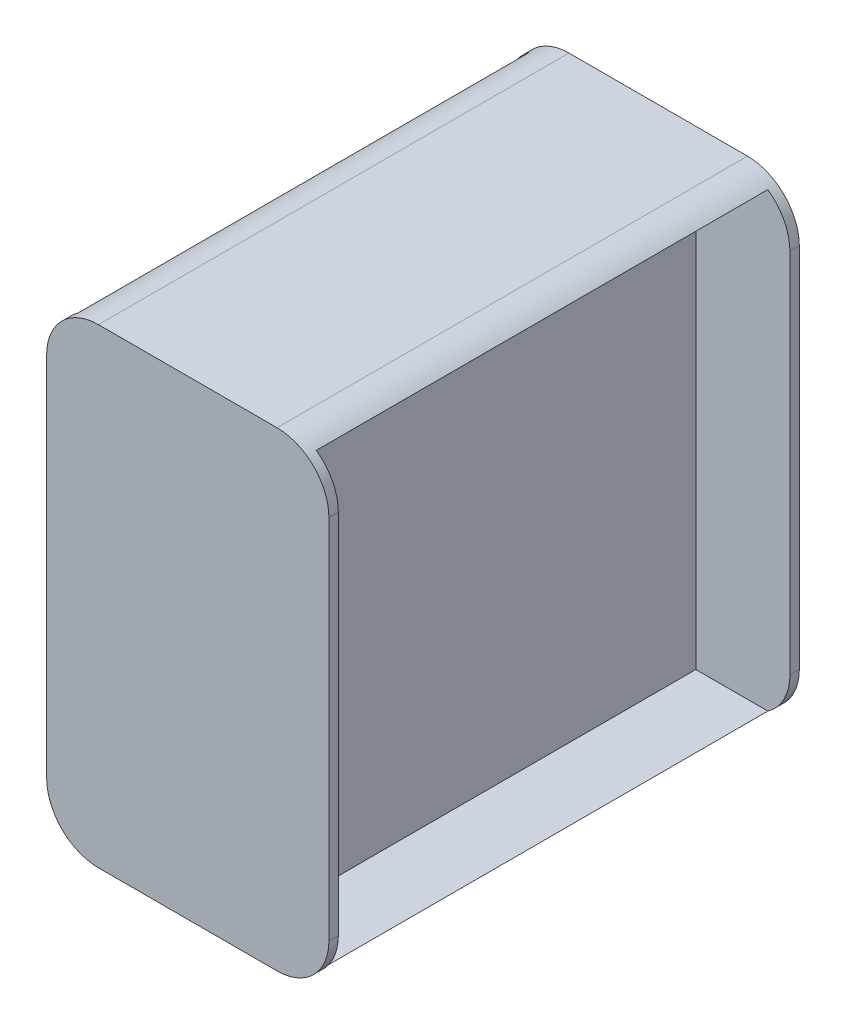
ISO-10303-21;
HEADER;
FILE_DESCRIPTION(('STEP AP214'),'2;1');
FILE_NAME('part.step','',(''),(''),'','','');
FILE_SCHEMA(('AUTOMOTIVE_DESIGN { 1 0 10303 214 1 1 1 1 }'));
ENDSEC;
DATA;
#1=APPLICATION_CONTEXT('core data for automotive mechanical design processes');
#2=APPLICATION_PROTOCOL_DEFINITION('international standard','automotive_design',2000,#1);
#3=PRODUCT_CONTEXT('',#1,'mechanical');
#4=PRODUCT('Part','Part','',(#3));
#5=PRODUCT_RELATED_PRODUCT_CATEGORY('part','',(#4));
#6=PRODUCT_DEFINITION_FORMATION('','',#4);
#7=PRODUCT_DEFINITION_CONTEXT('part definition',#1,'design');
#8=PRODUCT_DEFINITION('design','',#6,#7);
#9=PRODUCT_DEFINITION_SHAPE('','',#8);
#10=(LENGTH_UNIT() NAMED_UNIT(*) SI_UNIT(.MILLI.,.METRE.));
#11=(NAMED_UNIT(*) PLANE_ANGLE_UNIT() SI_UNIT($,.RADIAN.));
#12=(NAMED_UNIT(*) SI_UNIT($,.STERADIAN.) SOLID_ANGLE_UNIT());
#13=UNCERTAINTY_MEASURE_WITH_UNIT(LENGTH_MEASURE(1.E-05),#10,'distance_accuracy_value','');
#14=(GEOMETRIC_REPRESENTATION_CONTEXT(3) GLOBAL_UNCERTAINTY_ASSIGNED_CONTEXT((#13)) GLOBAL_UNIT_ASSIGNED_CONTEXT((#10,
#11,#12)) REPRESENTATION_CONTEXT('',''));
#15=CARTESIAN_POINT('',(0.,0.,0.));
#16=DIRECTION('',(0.,0.,1.));
#17=DIRECTION('',(1.,0.,0.));
#18=AXIS2_PLACEMENT_3D('',#15,#16,#17);
#19=CARTESIAN_POINT('',(19.05,63.5,-31.75));
#20=DIRECTION('',(-1.,0.,0.));
#21=DIRECTION('',(0.,0.,1.));
#22=AXIS2_PLACEMENT_3D('',#19,#20,#21);
#23=PLANE('',#22);
#24=DIRECTION('',(0.,-1.,0.));
#25=VECTOR('',#24,1.);
#26=CARTESIAN_POINT('',(19.05,63.5,31.75));
#27=LINE('',#26,#25);
#28=CARTESIAN_POINT('',(19.05,56.5,31.75));
#29=VERTEX_POINT('',#28);
#30=CARTESIAN_POINT('',(19.05,7.,31.75));
#31=VERTEX_POINT('',#30);
#32=EDGE_CURVE('E244',#29,#31,#27,.T.);
#33=ORIENTED_EDGE('',*,*,#32,.T.);
#34=DIRECTION('',(0.,0.,-1.));
#35=VECTOR('',#34,1.);
#36=CARTESIAN_POINT('',(19.05,7.,-31.75));
#37=LINE('',#36,#35);
#38=CARTESIAN_POINT('',(19.05,7.,30.48));
#39=VERTEX_POINT('',#38);
#40=EDGE_CURVE('E318',#31,#39,#37,.T.);
#41=ORIENTED_EDGE('',*,*,#40,.T.);
#42=DIRECTION('',(0.,-1.,0.));
#43=VECTOR('',#42,1.);
#44=CARTESIAN_POINT('',(19.05,0.,30.48));
#45=LINE('',#44,#43);
#46=CARTESIAN_POINT('',(19.05,56.5,30.48));
#47=VERTEX_POINT('',#46);
#48=EDGE_CURVE('E215',#47,#39,#45,.T.);
#49=ORIENTED_EDGE('',*,*,#48,.F.);
#50=DIRECTION('',(0.,0.,-1.));
#51=VECTOR('',#50,1.);
#52=CARTESIAN_POINT('',(19.05,56.5,31.75));
#53=LINE('',#52,#51);
#54=EDGE_CURVE('E270',#47,#29,#53,.F.);
#55=ORIENTED_EDGE('',*,*,#54,.T.);
#56=EDGE_LOOP('',(#33,#41,#49,#55));
#57=FACE_BOUND('',#56,.T.);
#58=ADVANCED_FACE('F36',(#57),#23,.F.);
#59=CARTESIAN_POINT('',(-19.05,63.5,-31.75));
#60=DIRECTION('',(1.,0.,0.));
#61=DIRECTION('',(0.,0.,-1.));
#62=AXIS2_PLACEMENT_3D('',#59,#60,#61);
#63=PLANE('',#62);
#64=DIRECTION('',(0.,-1.,0.));
#65=VECTOR('',#64,1.);
#66=CARTESIAN_POINT('',(-19.05,63.5,-31.75));
#67=LINE('',#66,#65);
#68=CARTESIAN_POINT('',(-19.05,56.5,-31.75));
#69=VERTEX_POINT('',#68);
#70=CARTESIAN_POINT('',(-19.05,7.,-31.75));
#71=VERTEX_POINT('',#70);
#72=EDGE_CURVE('E254',#69,#71,#67,.T.);
#73=ORIENTED_EDGE('',*,*,#72,.T.);
#74=DIRECTION('',(0.,0.,1.));
#75=VECTOR('',#74,1.);
#76=CARTESIAN_POINT('',(-19.05,7.,-31.75));
#77=LINE('',#76,#75);
#78=CARTESIAN_POINT('',(-19.05,7.,-30.48));
#79=VERTEX_POINT('',#78);
#80=EDGE_CURVE('E295',#71,#79,#77,.T.);
#81=ORIENTED_EDGE('',*,*,#80,.T.);
#82=DIRECTION('',(0.,-1.,0.));
#83=VECTOR('',#82,1.);
#84=CARTESIAN_POINT('',(-19.05,0.,-30.48));
#85=LINE('',#84,#83);
#86=CARTESIAN_POINT('',(-19.05,56.5,-30.48));
#87=VERTEX_POINT('',#86);
#88=EDGE_CURVE('E206',#87,#79,#85,.T.);
#89=ORIENTED_EDGE('',*,*,#88,.F.);
#90=DIRECTION('',(0.,0.,1.));
#91=VECTOR('',#90,1.);
#92=CARTESIAN_POINT('',(-19.05,56.5,-31.75));
#93=LINE('',#92,#91);
#94=EDGE_CURVE('E284',#87,#69,#93,.F.);
#95=ORIENTED_EDGE('',*,*,#94,.T.);
#96=EDGE_LOOP('',(#73,#81,#89,#95));
#97=FACE_BOUND('',#96,.T.);
#98=ADVANCED_FACE('F359',(#97),#63,.F.);
#99=DIRECTION('',(0.,-1.,0.));
#100=VECTOR('',#99,1.);
#101=CARTESIAN_POINT('',(-19.05,0.,30.48));
#102=LINE('',#101,#100);
#103=CARTESIAN_POINT('',(-19.05,56.5,30.48));
#104=VERTEX_POINT('',#103);
#105=CARTESIAN_POINT('',(-19.05,7.,30.48));
#106=VERTEX_POINT('',#105);
#107=EDGE_CURVE('E184',#104,#106,#102,.T.);
#108=ORIENTED_EDGE('',*,*,#107,.T.);
#109=DIRECTION('',(0.,0.,1.));
#110=VECTOR('',#109,1.);
#111=CARTESIAN_POINT('',(-19.05,7.,-31.75));
#112=LINE('',#111,#110);
#113=CARTESIAN_POINT('',(-19.05,7.,31.75));
#114=VERTEX_POINT('',#113);
#115=EDGE_CURVE('E293',#106,#114,#112,.T.);
#116=ORIENTED_EDGE('',*,*,#115,.T.);
#117=DIRECTION('',(0.,-1.,0.));
#118=VECTOR('',#117,1.);
#119=CARTESIAN_POINT('',(-19.05,63.5,31.75));
#120=LINE('',#119,#118);
#121=CARTESIAN_POINT('',(-19.05,56.5,31.75));
#122=VERTEX_POINT('',#121);
#123=EDGE_CURVE('E251',#122,#114,#120,.T.);
#124=ORIENTED_EDGE('',*,*,#123,.F.);
#125=DIRECTION('',(0.,0.,1.));
#126=VECTOR('',#125,1.);
#127=CARTESIAN_POINT('',(-19.05,56.5,-31.75));
#128=LINE('',#127,#126);
#129=EDGE_CURVE('E286',#122,#104,#128,.F.);
#130=ORIENTED_EDGE('',*,*,#129,.T.);
#131=EDGE_LOOP('',(#108,#116,#124,#130));
#132=FACE_BOUND('',#131,.T.);
#133=ADVANCED_FACE('F365',(#132),#63,.F.);
#134=DIRECTION('',(0.,-1.,0.));
#135=VECTOR('',#134,1.);
#136=CARTESIAN_POINT('',(19.05,0.,-30.48));
#137=LINE('',#136,#135);
#138=CARTESIAN_POINT('',(19.05,56.5,-30.48));
#139=VERTEX_POINT('',#138);
#140=CARTESIAN_POINT('',(19.05,7.,-30.48));
#141=VERTEX_POINT('',#140);
#142=EDGE_CURVE('E208',#139,#141,#137,.T.);
#143=ORIENTED_EDGE('',*,*,#142,.T.);
#144=DIRECTION('',(0.,0.,-1.));
#145=VECTOR('',#144,1.);
#146=CARTESIAN_POINT('',(19.05,7.,-31.75));
#147=LINE('',#146,#145);
#148=CARTESIAN_POINT('',(19.05,7.,-31.75));
#149=VERTEX_POINT('',#148);
#150=EDGE_CURVE('E316',#141,#149,#147,.T.);
#151=ORIENTED_EDGE('',*,*,#150,.T.);
#152=DIRECTION('',(0.,-1.,0.));
#153=VECTOR('',#152,1.);
#154=CARTESIAN_POINT('',(19.05,63.5,-31.75));
#155=LINE('',#154,#153);
#156=CARTESIAN_POINT('',(19.05,56.5,-31.75));
#157=VERTEX_POINT('',#156);
#158=EDGE_CURVE('E257',#157,#149,#155,.T.);
#159=ORIENTED_EDGE('',*,*,#158,.F.);
#160=DIRECTION('',(0.,0.,-1.));
#161=VECTOR('',#160,1.);
#162=CARTESIAN_POINT('',(19.05,56.5,31.75));
#163=LINE('',#162,#161);
#164=EDGE_CURVE('E272',#157,#139,#163,.F.);
#165=ORIENTED_EDGE('',*,*,#164,.T.);
#166=EDGE_LOOP('',(#143,#151,#159,#165));
#167=FACE_BOUND('',#166,.T.);
#168=ADVANCED_FACE('F390',(#167),#23,.F.);
#169=CARTESIAN_POINT('',(-19.05,63.5,-31.75));
#170=DIRECTION('',(0.,0.,1.));
#171=DIRECTION('',(1.,0.,0.));
#172=AXIS2_PLACEMENT_3D('',#169,#170,#171);
#173=PLANE('',#172);
#174=DIRECTION('',(-1.,0.,0.));
#175=VECTOR('',#174,1.);
#176=CARTESIAN_POINT('',(-19.05,0.,-31.75));
#177=LINE('',#176,#175);
#178=CARTESIAN_POINT('',(12.05,0.,-31.75));
#179=VERTEX_POINT('',#178);
#180=CARTESIAN_POINT('',(-12.05,0.,-31.75));
#181=VERTEX_POINT('',#180);
#182=EDGE_CURVE('E229',#179,#181,#177,.T.);
#183=ORIENTED_EDGE('',*,*,#182,.T.);
#184=CARTESIAN_POINT('',(-12.05,7.,-31.75));
#185=DIRECTION('',(0.,0.,1.));
#186=DIRECTION('',(1.,0.,0.));
#187=AXIS2_PLACEMENT_3D('',#184,#185,#186);
#188=CIRCLE('',#187,7.);
#189=EDGE_CURVE('E314',#181,#71,#188,.F.);
#190=ORIENTED_EDGE('',*,*,#189,.T.);
#191=ORIENTED_EDGE('',*,*,#72,.F.);
#192=CARTESIAN_POINT('',(-12.05,56.5,-31.75));
#193=DIRECTION('',(0.,0.,1.));
#194=DIRECTION('',(1.,0.,0.));
#195=AXIS2_PLACEMENT_3D('',#192,#193,#194);
#196=CIRCLE('',#195,7.);
#197=CARTESIAN_POINT('',(-12.05,63.5,-31.75));
#198=VERTEX_POINT('',#197);
#199=EDGE_CURVE('E266',#69,#198,#196,.F.);
#200=ORIENTED_EDGE('',*,*,#199,.T.);
#201=DIRECTION('',(-1.,0.,0.));
#202=VECTOR('',#201,1.);
#203=CARTESIAN_POINT('',(-19.05,63.5,-31.75));
#204=LINE('',#203,#202);
#205=CARTESIAN_POINT('',(12.05,63.5,-31.75));
#206=VERTEX_POINT('',#205);
#207=EDGE_CURVE('E237',#206,#198,#204,.T.);
#208=ORIENTED_EDGE('',*,*,#207,.F.);
#209=CARTESIAN_POINT('',(12.05,56.5,-31.75));
#210=DIRECTION('',(0.,0.,1.));
#211=DIRECTION('',(1.,0.,0.));
#212=AXIS2_PLACEMENT_3D('',#209,#210,#211);
#213=CIRCLE('',#212,7.);
#214=EDGE_CURVE('E268',#206,#157,#213,.F.);
#215=ORIENTED_EDGE('',*,*,#214,.T.);
#216=ORIENTED_EDGE('',*,*,#158,.T.);
#217=CARTESIAN_POINT('',(12.05,7.,-31.75));
#218=DIRECTION('',(0.,0.,1.));
#219=DIRECTION('',(1.,0.,0.));
#220=AXIS2_PLACEMENT_3D('',#217,#218,#219);
#221=CIRCLE('',#220,7.);
#222=EDGE_CURVE('E312',#149,#179,#221,.F.);
#223=ORIENTED_EDGE('',*,*,#222,.T.);
#224=EDGE_LOOP('',(#183,#190,#191,#200,#208,#215,#216,#223));
#225=FACE_BOUND('',#224,.T.);
#226=ADVANCED_FACE('F350',(#225),#173,.F.);
#227=CARTESIAN_POINT('',(-19.05,63.5,31.75));
#228=DIRECTION('',(0.,0.,-1.));
#229=DIRECTION('',(-1.,0.,0.));
#230=AXIS2_PLACEMENT_3D('',#227,#228,#229);
#231=PLANE('',#230);
#232=ORIENTED_EDGE('',*,*,#123,.T.);
#233=CARTESIAN_POINT('',(-12.05,7.,31.75));
#234=DIRECTION('',(0.,0.,-1.));
#235=DIRECTION('',(-1.,0.,0.));
#236=AXIS2_PLACEMENT_3D('',#233,#234,#235);
#237=CIRCLE('',#236,7.);
#238=CARTESIAN_POINT('',(-12.05,0.,31.75));
#239=VERTEX_POINT('',#238);
#240=EDGE_CURVE('E306',#114,#239,#237,.F.);
#241=ORIENTED_EDGE('',*,*,#240,.T.);
#242=DIRECTION('',(1.,0.,0.));
#243=VECTOR('',#242,1.);
#244=CARTESIAN_POINT('',(-19.05,0.,31.75));
#245=LINE('',#244,#243);
#246=CARTESIAN_POINT('',(12.05,0.,31.75));
#247=VERTEX_POINT('',#246);
#248=EDGE_CURVE('E241',#239,#247,#245,.T.);
#249=ORIENTED_EDGE('',*,*,#248,.T.);
#250=CARTESIAN_POINT('',(12.05,7.,31.75));
#251=DIRECTION('',(0.,0.,-1.));
#252=DIRECTION('',(-1.,0.,0.));
#253=AXIS2_PLACEMENT_3D('',#250,#251,#252);
#254=CIRCLE('',#253,7.);
#255=EDGE_CURVE('E304',#247,#31,#254,.F.);
#256=ORIENTED_EDGE('',*,*,#255,.T.);
#257=ORIENTED_EDGE('',*,*,#32,.F.);
#258=CARTESIAN_POINT('',(12.05,56.5,31.75));
#259=DIRECTION('',(0.,0.,-1.));
#260=DIRECTION('',(-1.,0.,0.));
#261=AXIS2_PLACEMENT_3D('',#258,#259,#260);
#262=CIRCLE('',#261,7.);
#263=CARTESIAN_POINT('',(12.05,63.5,31.75));
#264=VERTEX_POINT('',#263);
#265=EDGE_CURVE('E282',#29,#264,#262,.F.);
#266=ORIENTED_EDGE('',*,*,#265,.T.);
#267=DIRECTION('',(1.,0.,0.));
#268=VECTOR('',#267,1.);
#269=CARTESIAN_POINT('',(-19.05,63.5,31.75));
#270=LINE('',#269,#268);
#271=CARTESIAN_POINT('',(-12.05,63.5,31.75));
#272=VERTEX_POINT('',#271);
#273=EDGE_CURVE('E240',#272,#264,#270,.T.);
#274=ORIENTED_EDGE('',*,*,#273,.F.);
#275=CARTESIAN_POINT('',(-12.05,56.5,31.75));
#276=DIRECTION('',(0.,0.,-1.));
#277=DIRECTION('',(-1.,0.,0.));
#278=AXIS2_PLACEMENT_3D('',#275,#276,#277);
#279=CIRCLE('',#278,7.);
#280=EDGE_CURVE('E280',#272,#122,#279,.F.);
#281=ORIENTED_EDGE('',*,*,#280,.T.);
#282=EDGE_LOOP('',(#232,#241,#249,#256,#257,#266,#274,#281));
#283=FACE_BOUND('',#282,.T.);
#284=ADVANCED_FACE('F338',(#283),#231,.F.);
#285=CARTESIAN_POINT('',(0.,63.5,0.));
#286=DIRECTION('',(0.,1.,0.));
#287=DIRECTION('',(0.,0.,1.));
#288=AXIS2_PLACEMENT_3D('',#285,#286,#287);
#289=PLANE('',#288);
#290=ORIENTED_EDGE('',*,*,#273,.T.);
#291=DIRECTION('',(0.,0.,-1.));
#292=VECTOR('',#291,1.);
#293=CARTESIAN_POINT('',(12.05,63.5,-31.75));
#294=LINE('',#293,#292);
#295=EDGE_CURVE('E263',#264,#206,#294,.T.);
#296=ORIENTED_EDGE('',*,*,#295,.T.);
#297=ORIENTED_EDGE('',*,*,#207,.T.);
#298=DIRECTION('',(0.,0.,1.));
#299=VECTOR('',#298,1.);
#300=CARTESIAN_POINT('',(-12.05,63.5,31.75));
#301=LINE('',#300,#299);
#302=EDGE_CURVE('E260',#198,#272,#301,.T.);
#303=ORIENTED_EDGE('',*,*,#302,.T.);
#304=EDGE_LOOP('',(#290,#296,#297,#303));
#305=FACE_BOUND('',#304,.T.);
#306=ADVANCED_FACE('F419',(#305),#289,.T.);
#307=CARTESIAN_POINT('',(0.,0.,0.));
#308=DIRECTION('',(0.,1.,0.));
#309=DIRECTION('',(0.,0.,1.));
#310=AXIS2_PLACEMENT_3D('',#307,#308,#309);
#311=PLANE('',#310);
#312=ORIENTED_EDGE('',*,*,#248,.F.);
#313=DIRECTION('',(0.,0.,1.));
#314=VECTOR('',#313,1.);
#315=CARTESIAN_POINT('',(-12.05,0.,0.));
#316=LINE('',#315,#314);
#317=EDGE_CURVE('E310',#239,#181,#316,.F.);
#318=ORIENTED_EDGE('',*,*,#317,.T.);
#319=ORIENTED_EDGE('',*,*,#182,.F.);
#320=DIRECTION('',(0.,0.,-1.));
#321=VECTOR('',#320,1.);
#322=CARTESIAN_POINT('',(12.05,0.,0.));
#323=LINE('',#322,#321);
#324=EDGE_CURVE('E308',#179,#247,#323,.F.);
#325=ORIENTED_EDGE('',*,*,#324,.T.);
#326=EDGE_LOOP('',(#312,#318,#319,#325));
#327=FACE_BOUND('',#326,.T.);
#328=ADVANCED_FACE('F346',(#327),#311,.F.);
#329=CARTESIAN_POINT('',(6.35,0.,-30.48));
#330=DIRECTION('',(0.,0.,1.));
#331=DIRECTION('',(0.,-1.,0.));
#332=AXIS2_PLACEMENT_3D('',#329,#330,#331);
#333=PLANE('',#332);
#334=DIRECTION('',(1.,0.,0.));
#335=VECTOR('',#334,1.);
#336=CARTESIAN_POINT('',(6.35,1.27000000000001,-30.48));
#337=LINE('',#336,#335);
#338=CARTESIAN_POINT('',(6.35,1.27000000000001,-30.48));
#339=VERTEX_POINT('',#338);
#340=CARTESIAN_POINT('',(16.0708332469776,1.27000000000001,-30.48));
#341=VERTEX_POINT('',#340);
#342=EDGE_CURVE('E227',#339,#341,#337,.T.);
#343=ORIENTED_EDGE('',*,*,#342,.T.);
#344=CARTESIAN_POINT('',(12.05,7.,-30.48));
#345=DIRECTION('',(0.,0.,1.));
#346=DIRECTION('',(0.,-1.,0.));
#347=AXIS2_PLACEMENT_3D('',#344,#345,#346);
#348=CIRCLE('',#347,7.);
#349=EDGE_CURVE('E11',#341,#141,#348,.T.);
#350=ORIENTED_EDGE('',*,*,#349,.T.);
#351=ORIENTED_EDGE('',*,*,#142,.F.);
#352=CARTESIAN_POINT('',(12.05,56.5,-30.48));
#353=DIRECTION('',(0.,0.,1.));
#354=DIRECTION('',(0.,-1.,0.));
#355=AXIS2_PLACEMENT_3D('',#352,#353,#354);
#356=CIRCLE('',#355,7.);
#357=CARTESIAN_POINT('',(16.0708332469776,62.23,-30.48));
#358=VERTEX_POINT('',#357);
#359=EDGE_CURVE('E274',#139,#358,#356,.T.);
#360=ORIENTED_EDGE('',*,*,#359,.T.);
#361=DIRECTION('',(1.,0.,0.));
#362=VECTOR('',#361,1.);
#363=CARTESIAN_POINT('',(6.35,62.23,-30.48));
#364=LINE('',#363,#362);
#365=CARTESIAN_POINT('',(6.35,62.23,-30.48));
#366=VERTEX_POINT('',#365);
#367=EDGE_CURVE('E223',#366,#358,#364,.T.);
#368=ORIENTED_EDGE('',*,*,#367,.F.);
#369=DIRECTION('',(0.,-1.,0.));
#370=VECTOR('',#369,1.);
#371=CARTESIAN_POINT('',(6.35,0.,-30.48));
#372=LINE('',#371,#370);
#373=EDGE_CURVE('E212',#366,#339,#372,.T.);
#374=ORIENTED_EDGE('',*,*,#373,.T.);
#375=EDGE_LOOP('',(#343,#350,#351,#360,#368,#374));
#376=FACE_BOUND('',#375,.T.);
#377=ADVANCED_FACE('F408',(#376),#333,.T.);
#378=CARTESIAN_POINT('',(6.35000000000001,1.27000000000001,0.));
#379=DIRECTION('',(0.,-1.,0.));
#380=DIRECTION('',(0.,0.,-1.));
#381=AXIS2_PLACEMENT_3D('',#378,#379,#380);
#382=PLANE('',#381);
#383=DIRECTION('',(1.,0.,0.));
#384=VECTOR('',#383,1.);
#385=CARTESIAN_POINT('',(6.35000000000001,1.27000000000001,30.48));
#386=LINE('',#385,#384);
#387=CARTESIAN_POINT('',(6.35000000000001,1.27000000000001,30.48));
#388=VERTEX_POINT('',#387);
#389=CARTESIAN_POINT('',(16.0708332469776,1.27000000000001,30.48));
#390=VERTEX_POINT('',#389);
#391=EDGE_CURVE('E230',#388,#390,#386,.T.);
#392=ORIENTED_EDGE('',*,*,#391,.T.);
#393=DIRECTION('',(0.,0.,-1.));
#394=VECTOR('',#393,1.);
#395=CARTESIAN_POINT('',(16.0708332469776,1.27000000000001,30.48));
#396=LINE('',#395,#394);
#397=EDGE_CURVE('E44',#390,#341,#396,.T.);
#398=ORIENTED_EDGE('',*,*,#397,.T.);
#399=ORIENTED_EDGE('',*,*,#342,.F.);
#400=DIRECTION('',(0.,0.,-1.));
#401=VECTOR('',#400,1.);
#402=CARTESIAN_POINT('',(6.35000000000001,1.27000000000001,0.));
#403=LINE('',#402,#401);
#404=EDGE_CURVE('E220',#388,#339,#403,.T.);
#405=ORIENTED_EDGE('',*,*,#404,.F.);
#406=EDGE_LOOP('',(#392,#398,#399,#405));
#407=FACE_BOUND('',#406,.T.);
#408=ADVANCED_FACE('F412',(#407),#382,.F.);
#409=CARTESIAN_POINT('',(6.35000000000001,0.,30.48));
#410=DIRECTION('',(0.,0.,1.));
#411=DIRECTION('',(0.,-1.,0.));
#412=AXIS2_PLACEMENT_3D('',#409,#410,#411);
#413=PLANE('',#412);
#414=ORIENTED_EDGE('',*,*,#48,.T.);
#415=CARTESIAN_POINT('',(12.05,7.,30.48));
#416=DIRECTION('',(0.,0.,1.));
#417=DIRECTION('',(0.,-1.,0.));
#418=AXIS2_PLACEMENT_3D('',#415,#416,#417);
#419=CIRCLE('',#418,7.);
#420=EDGE_CURVE('E58',#39,#390,#419,.F.);
#421=ORIENTED_EDGE('',*,*,#420,.T.);
#422=ORIENTED_EDGE('',*,*,#391,.F.);
#423=DIRECTION('',(0.,-1.,0.));
#424=VECTOR('',#423,1.);
#425=CARTESIAN_POINT('',(6.35000000000001,0.,30.48));
#426=LINE('',#425,#424);
#427=CARTESIAN_POINT('',(6.35000000000001,62.23,30.48));
#428=VERTEX_POINT('',#427);
#429=EDGE_CURVE('E217',#428,#388,#426,.T.);
#430=ORIENTED_EDGE('',*,*,#429,.F.);
#431=DIRECTION('',(1.,0.,0.));
#432=VECTOR('',#431,1.);
#433=CARTESIAN_POINT('',(6.35000000000001,62.23,30.48));
#434=LINE('',#433,#432);
#435=CARTESIAN_POINT('',(16.0708332469776,62.23,30.48));
#436=VERTEX_POINT('',#435);
#437=EDGE_CURVE('E232',#428,#436,#434,.T.);
#438=ORIENTED_EDGE('',*,*,#437,.T.);
#439=CARTESIAN_POINT('',(12.05,56.5,30.48));
#440=DIRECTION('',(0.,0.,1.));
#441=DIRECTION('',(0.,-1.,0.));
#442=AXIS2_PLACEMENT_3D('',#439,#440,#441);
#443=CIRCLE('',#442,7.);
#444=EDGE_CURVE('E278',#436,#47,#443,.F.);
#445=ORIENTED_EDGE('',*,*,#444,.T.);
#446=EDGE_LOOP('',(#414,#421,#422,#430,#438,#445));
#447=FACE_BOUND('',#446,.T.);
#448=ADVANCED_FACE('F328',(#447),#413,.F.);
#449=CARTESIAN_POINT('',(6.35000000000001,62.23,0.));
#450=DIRECTION('',(0.,-1.,0.));
#451=DIRECTION('',(0.,0.,-1.));
#452=AXIS2_PLACEMENT_3D('',#449,#450,#451);
#453=PLANE('',#452);
#454=ORIENTED_EDGE('',*,*,#367,.T.);
#455=DIRECTION('',(0.,0.,1.));
#456=VECTOR('',#455,1.);
#457=CARTESIAN_POINT('',(16.0708332469776,62.23,-30.48));
#458=LINE('',#457,#456);
#459=EDGE_CURVE('E276',#358,#436,#458,.T.);
#460=ORIENTED_EDGE('',*,*,#459,.T.);
#461=ORIENTED_EDGE('',*,*,#437,.F.);
#462=DIRECTION('',(0.,0.,-1.));
#463=VECTOR('',#462,1.);
#464=CARTESIAN_POINT('',(6.35000000000001,62.23,0.));
#465=LINE('',#464,#463);
#466=EDGE_CURVE('E214',#428,#366,#465,.T.);
#467=ORIENTED_EDGE('',*,*,#466,.T.);
#468=EDGE_LOOP('',(#454,#460,#461,#467));
#469=FACE_BOUND('',#468,.T.);
#470=ADVANCED_FACE('F416',(#469),#453,.T.);
#471=CARTESIAN_POINT('',(6.35000000000001,0.,0.));
#472=DIRECTION('',(1.,0.,0.));
#473=DIRECTION('',(0.,0.,-1.));
#474=AXIS2_PLACEMENT_3D('',#471,#472,#473);
#475=PLANE('',#474);
#476=ORIENTED_EDGE('',*,*,#373,.F.);
#477=ORIENTED_EDGE('',*,*,#466,.F.);
#478=ORIENTED_EDGE('',*,*,#429,.T.);
#479=ORIENTED_EDGE('',*,*,#404,.T.);
#480=EDGE_LOOP('',(#476,#477,#478,#479));
#481=FACE_BOUND('',#480,.T.);
#482=ADVANCED_FACE('F385',(#481),#475,.T.);
#483=CARTESIAN_POINT('',(-19.05,0.,-30.48));
#484=DIRECTION('',(0.,0.,1.));
#485=DIRECTION('',(0.,-1.,0.));
#486=AXIS2_PLACEMENT_3D('',#483,#484,#485);
#487=PLANE('',#486);
#488=ORIENTED_EDGE('',*,*,#88,.T.);
#489=CARTESIAN_POINT('',(-12.05,7.,-30.48));
#490=DIRECTION('',(0.,0.,1.));
#491=DIRECTION('',(0.,-1.,0.));
#492=AXIS2_PLACEMENT_3D('',#489,#490,#491);
#493=CIRCLE('',#492,7.);
#494=CARTESIAN_POINT('',(-16.0708332469776,1.27000000000001,-30.48));
#495=VERTEX_POINT('',#494);
#496=EDGE_CURVE('E298',#79,#495,#493,.T.);
#497=ORIENTED_EDGE('',*,*,#496,.T.);
#498=DIRECTION('',(1.,0.,0.));
#499=VECTOR('',#498,1.);
#500=CARTESIAN_POINT('',(-19.05,1.27000000000001,-30.48));
#501=LINE('',#500,#499);
#502=CARTESIAN_POINT('',(-6.34999999999999,1.27000000000001,-30.48));
#503=VERTEX_POINT('',#502);
#504=EDGE_CURVE('E198',#495,#503,#501,.T.);
#505=ORIENTED_EDGE('',*,*,#504,.T.);
#506=DIRECTION('',(0.,-1.,0.));
#507=VECTOR('',#506,1.);
#508=CARTESIAN_POINT('',(-6.34999999999999,0.,-30.48));
#509=LINE('',#508,#507);
#510=CARTESIAN_POINT('',(-6.34999999999999,62.23,-30.48));
#511=VERTEX_POINT('',#510);
#512=EDGE_CURVE('E190',#511,#503,#509,.T.);
#513=ORIENTED_EDGE('',*,*,#512,.F.);
#514=DIRECTION('',(1.,0.,0.));
#515=VECTOR('',#514,1.);
#516=CARTESIAN_POINT('',(-19.05,62.23,-30.48));
#517=LINE('',#516,#515);
#518=CARTESIAN_POINT('',(-16.0708332469775,62.23,-30.48));
#519=VERTEX_POINT('',#518);
#520=EDGE_CURVE('E172',#519,#511,#517,.T.);
#521=ORIENTED_EDGE('',*,*,#520,.F.);
#522=CARTESIAN_POINT('',(-12.05,56.5,-30.48));
#523=DIRECTION('',(0.,0.,1.));
#524=DIRECTION('',(0.,-1.,0.));
#525=AXIS2_PLACEMENT_3D('',#522,#523,#524);
#526=CIRCLE('',#525,7.);
#527=EDGE_CURVE('E291',#519,#87,#526,.T.);
#528=ORIENTED_EDGE('',*,*,#527,.T.);
#529=EDGE_LOOP('',(#488,#497,#505,#513,#521,#528));
#530=FACE_BOUND('',#529,.T.);
#531=ADVANCED_FACE('F196',(#530),#487,.T.);
#532=CARTESIAN_POINT('',(-19.05,1.27000000000001,0.));
#533=DIRECTION('',(0.,-1.,0.));
#534=DIRECTION('',(0.,0.,-1.));
#535=AXIS2_PLACEMENT_3D('',#532,#533,#534);
#536=PLANE('',#535);
#537=ORIENTED_EDGE('',*,*,#504,.F.);
#538=DIRECTION('',(0.,0.,1.));
#539=VECTOR('',#538,1.);
#540=CARTESIAN_POINT('',(-16.0708332469776,1.27000000000001,-30.48));
#541=LINE('',#540,#539);
#542=CARTESIAN_POINT('',(-16.0708332469775,1.27000000000001,30.48));
#543=VERTEX_POINT('',#542);
#544=EDGE_CURVE('E300',#495,#543,#541,.T.);
#545=ORIENTED_EDGE('',*,*,#544,.T.);
#546=DIRECTION('',(1.,0.,0.));
#547=VECTOR('',#546,1.);
#548=CARTESIAN_POINT('',(-19.05,1.27000000000001,30.48));
#549=LINE('',#548,#547);
#550=CARTESIAN_POINT('',(-6.34999999999999,1.27000000000001,30.48));
#551=VERTEX_POINT('',#550);
#552=EDGE_CURVE('E209',#543,#551,#549,.T.);
#553=ORIENTED_EDGE('',*,*,#552,.T.);
#554=DIRECTION('',(0.,0.,-1.));
#555=VECTOR('',#554,1.);
#556=CARTESIAN_POINT('',(-6.34999999999999,1.27000000000001,0.));
#557=LINE('',#556,#555);
#558=EDGE_CURVE('E204',#551,#503,#557,.T.);
#559=ORIENTED_EDGE('',*,*,#558,.T.);
#560=EDGE_LOOP('',(#537,#545,#553,#559));
#561=FACE_BOUND('',#560,.T.);
#562=ADVANCED_FACE('F377',(#561),#536,.F.);
#563=CARTESIAN_POINT('',(-19.05,0.,30.48));
#564=DIRECTION('',(0.,0.,1.));
#565=DIRECTION('',(0.,-1.,0.));
#566=AXIS2_PLACEMENT_3D('',#563,#564,#565);
#567=PLANE('',#566);
#568=ORIENTED_EDGE('',*,*,#552,.F.);
#569=CARTESIAN_POINT('',(-12.05,7.,30.48));
#570=DIRECTION('',(0.,0.,1.));
#571=DIRECTION('',(0.,-1.,0.));
#572=AXIS2_PLACEMENT_3D('',#569,#570,#571);
#573=CIRCLE('',#572,7.);
#574=EDGE_CURVE('E302',#543,#106,#573,.F.);
#575=ORIENTED_EDGE('',*,*,#574,.T.);
#576=ORIENTED_EDGE('',*,*,#107,.F.);
#577=CARTESIAN_POINT('',(-12.05,56.5,30.48));
#578=DIRECTION('',(0.,0.,1.));
#579=DIRECTION('',(0.,-1.,0.));
#580=AXIS2_PLACEMENT_3D('',#577,#578,#579);
#581=CIRCLE('',#580,7.);
#582=CARTESIAN_POINT('',(-16.0708332469775,62.23,30.48));
#583=VERTEX_POINT('',#582);
#584=EDGE_CURVE('E288',#104,#583,#581,.F.);
#585=ORIENTED_EDGE('',*,*,#584,.T.);
#586=DIRECTION('',(1.,0.,0.));
#587=VECTOR('',#586,1.);
#588=CARTESIAN_POINT('',(-19.05,62.23,30.48));
#589=LINE('',#588,#587);
#590=CARTESIAN_POINT('',(-6.34999999999999,62.23,30.48));
#591=VERTEX_POINT('',#590);
#592=EDGE_CURVE('E183',#583,#591,#589,.T.);
#593=ORIENTED_EDGE('',*,*,#592,.T.);
#594=DIRECTION('',(0.,-1.,0.));
#595=VECTOR('',#594,1.);
#596=CARTESIAN_POINT('',(-6.34999999999999,0.,30.48));
#597=LINE('',#596,#595);
#598=EDGE_CURVE('E193',#591,#551,#597,.T.);
#599=ORIENTED_EDGE('',*,*,#598,.T.);
#600=EDGE_LOOP('',(#568,#575,#576,#585,#593,#599));
#601=FACE_BOUND('',#600,.T.);
#602=ADVANCED_FACE('F375',(#601),#567,.F.);
#603=CARTESIAN_POINT('',(-19.05,62.23,0.));
#604=DIRECTION('',(0.,-1.,0.));
#605=DIRECTION('',(0.,0.,-1.));
#606=AXIS2_PLACEMENT_3D('',#603,#604,#605);
#607=PLANE('',#606);
#608=ORIENTED_EDGE('',*,*,#592,.F.);
#609=DIRECTION('',(0.,0.,-1.));
#610=VECTOR('',#609,1.);
#611=CARTESIAN_POINT('',(-16.0708332469775,62.23,30.48));
#612=LINE('',#611,#610);
#613=EDGE_CURVE('E179',#583,#519,#612,.T.);
#614=ORIENTED_EDGE('',*,*,#613,.T.);
#615=ORIENTED_EDGE('',*,*,#520,.T.);
#616=DIRECTION('',(0.,0.,-1.));
#617=VECTOR('',#616,1.);
#618=CARTESIAN_POINT('',(-6.34999999999999,62.23,0.));
#619=LINE('',#618,#617);
#620=EDGE_CURVE('E176',#591,#511,#619,.T.);
#621=ORIENTED_EDGE('',*,*,#620,.F.);
#622=EDGE_LOOP('',(#608,#614,#615,#621));
#623=FACE_BOUND('',#622,.T.);
#624=ADVANCED_FACE('F175',(#623),#607,.T.);
#625=CARTESIAN_POINT('',(-6.34999999999999,0.,0.));
#626=DIRECTION('',(1.,0.,0.));
#627=DIRECTION('',(0.,0.,-1.));
#628=AXIS2_PLACEMENT_3D('',#625,#626,#627);
#629=PLANE('',#628);
#630=ORIENTED_EDGE('',*,*,#512,.T.);
#631=ORIENTED_EDGE('',*,*,#558,.F.);
#632=ORIENTED_EDGE('',*,*,#598,.F.);
#633=ORIENTED_EDGE('',*,*,#620,.T.);
#634=EDGE_LOOP('',(#630,#631,#632,#633));
#635=FACE_BOUND('',#634,.T.);
#636=ADVANCED_FACE('F188',(#635),#629,.F.);
#637=CARTESIAN_POINT('',(12.05,56.5,0.));
#638=DIRECTION('',(0.,0.,1.));
#639=DIRECTION('',(1.,0.,0.));
#640=AXIS2_PLACEMENT_3D('',#637,#638,#639);
#641=CYLINDRICAL_SURFACE('',#640,7.);
#642=ORIENTED_EDGE('',*,*,#359,.F.);
#643=ORIENTED_EDGE('',*,*,#164,.F.);
#644=ORIENTED_EDGE('',*,*,#214,.F.);
#645=ORIENTED_EDGE('',*,*,#295,.F.);
#646=ORIENTED_EDGE('',*,*,#265,.F.);
#647=ORIENTED_EDGE('',*,*,#54,.F.);
#648=ORIENTED_EDGE('',*,*,#444,.F.);
#649=ORIENTED_EDGE('',*,*,#459,.F.);
#650=EDGE_LOOP('',(#642,#643,#644,#645,#646,#647,#648,#649));
#651=FACE_BOUND('',#650,.T.);
#652=ADVANCED_FACE('F334',(#651),#641,.T.);
#653=CARTESIAN_POINT('',(-12.05,56.5,0.));
#654=DIRECTION('',(0.,0.,-1.));
#655=DIRECTION('',(-1.,0.,0.));
#656=AXIS2_PLACEMENT_3D('',#653,#654,#655);
#657=CYLINDRICAL_SURFACE('',#656,7.);
#658=ORIENTED_EDGE('',*,*,#584,.F.);
#659=ORIENTED_EDGE('',*,*,#129,.F.);
#660=ORIENTED_EDGE('',*,*,#280,.F.);
#661=ORIENTED_EDGE('',*,*,#302,.F.);
#662=ORIENTED_EDGE('',*,*,#199,.F.);
#663=ORIENTED_EDGE('',*,*,#94,.F.);
#664=ORIENTED_EDGE('',*,*,#527,.F.);
#665=ORIENTED_EDGE('',*,*,#613,.F.);
#666=EDGE_LOOP('',(#658,#659,#660,#661,#662,#663,#664,#665));
#667=FACE_BOUND('',#666,.T.);
#668=ADVANCED_FACE('F372',(#667),#657,.T.);
#669=CARTESIAN_POINT('',(-12.05,7.,-31.75));
#670=DIRECTION('',(0.,0.,1.));
#671=DIRECTION('',(1.,0.,0.));
#672=AXIS2_PLACEMENT_3D('',#669,#670,#671);
#673=CYLINDRICAL_SURFACE('',#672,7.);
#674=ORIENTED_EDGE('',*,*,#189,.F.);
#675=ORIENTED_EDGE('',*,*,#317,.F.);
#676=ORIENTED_EDGE('',*,*,#240,.F.);
#677=ORIENTED_EDGE('',*,*,#115,.F.);
#678=ORIENTED_EDGE('',*,*,#574,.F.);
#679=ORIENTED_EDGE('',*,*,#544,.F.);
#680=ORIENTED_EDGE('',*,*,#496,.F.);
#681=ORIENTED_EDGE('',*,*,#80,.F.);
#682=EDGE_LOOP('',(#674,#675,#676,#677,#678,#679,#680,#681));
#683=FACE_BOUND('',#682,.T.);
#684=ADVANCED_FACE('F354',(#683),#673,.T.);
#685=CARTESIAN_POINT('',(12.05,7.,-31.75));
#686=DIRECTION('',(0.,0.,-1.));
#687=DIRECTION('',(-1.,0.,0.));
#688=AXIS2_PLACEMENT_3D('',#685,#686,#687);
#689=CYLINDRICAL_SURFACE('',#688,7.);
#690=ORIENTED_EDGE('',*,*,#255,.F.);
#691=ORIENTED_EDGE('',*,*,#324,.F.);
#692=ORIENTED_EDGE('',*,*,#222,.F.);
#693=ORIENTED_EDGE('',*,*,#150,.F.);
#694=ORIENTED_EDGE('',*,*,#349,.F.);
#695=ORIENTED_EDGE('',*,*,#397,.F.);
#696=ORIENTED_EDGE('',*,*,#420,.F.);
#697=ORIENTED_EDGE('',*,*,#40,.F.);
#698=EDGE_LOOP('',(#690,#691,#692,#693,#694,#695,#696,#697));
#699=FACE_BOUND('',#698,.T.);
#700=ADVANCED_FACE('F38',(#699),#689,.T.);
#701=CLOSED_SHELL('',(#58,#98,#133,#168,#226,#284,#306,#328,#377,#408,#448,#470,#482,#531,#562,
#602,#624,#636,#652,#668,#684,#700));
#702=MANIFOLD_SOLID_BREP('B2',#701);
#703=ADVANCED_BREP_SHAPE_REPRESENTATION('',(#18,#702),#14);
#704=SHAPE_DEFINITION_REPRESENTATION(#9,#703);
ENDSEC;
END-ISO-10303-21;
